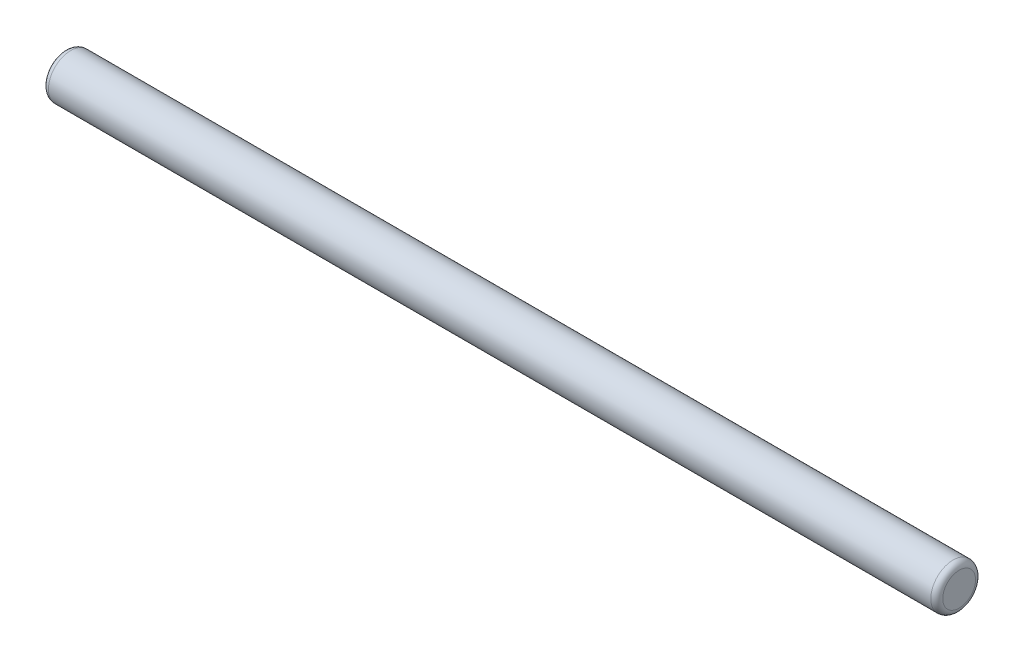
ISO-10303-21;
HEADER;
FILE_DESCRIPTION(('STEP AP214'),'2;1');
FILE_NAME('part.step','',(''),(''),'','','');
FILE_SCHEMA(('AUTOMOTIVE_DESIGN { 1 0 10303 214 1 1 1 1 }'));
ENDSEC;
DATA;
#1=APPLICATION_CONTEXT('core data for automotive mechanical design processes');
#2=APPLICATION_PROTOCOL_DEFINITION('international standard','automotive_design',2000,#1);
#3=PRODUCT_CONTEXT('',#1,'mechanical');
#4=PRODUCT('Part','Part','',(#3));
#5=PRODUCT_RELATED_PRODUCT_CATEGORY('part','',(#4));
#6=PRODUCT_DEFINITION_FORMATION('','',#4);
#7=PRODUCT_DEFINITION_CONTEXT('part definition',#1,'design');
#8=PRODUCT_DEFINITION('design','',#6,#7);
#9=PRODUCT_DEFINITION_SHAPE('','',#8);
#10=(LENGTH_UNIT() NAMED_UNIT(*) SI_UNIT(.MILLI.,.METRE.));
#11=(NAMED_UNIT(*) PLANE_ANGLE_UNIT() SI_UNIT($,.RADIAN.));
#12=(NAMED_UNIT(*) SI_UNIT($,.STERADIAN.) SOLID_ANGLE_UNIT());
#13=UNCERTAINTY_MEASURE_WITH_UNIT(LENGTH_MEASURE(1.E-05),#10,'distance_accuracy_value','');
#14=(GEOMETRIC_REPRESENTATION_CONTEXT(3) GLOBAL_UNCERTAINTY_ASSIGNED_CONTEXT((#13)) GLOBAL_UNIT_ASSIGNED_CONTEXT((#10,
#11,#12)) REPRESENTATION_CONTEXT('',''));
#15=CARTESIAN_POINT('',(0.,0.,0.));
#16=DIRECTION('',(0.,0.,1.));
#17=DIRECTION('',(1.,0.,0.));
#18=AXIS2_PLACEMENT_3D('',#15,#16,#17);
#19=CARTESIAN_POINT('',(3.,0.,0.));
#20=DIRECTION('',(-1.,0.,0.));
#21=DIRECTION('',(0.,0.,1.));
#22=AXIS2_PLACEMENT_3D('',#19,#20,#21);
#23=CYLINDRICAL_SURFACE('',#22,0.075);
#24=CARTESIAN_POINT('',(2.98,0.,0.));
#25=DIRECTION('',(1.,0.,0.));
#26=DIRECTION('',(0.,0.,-1.));
#27=AXIS2_PLACEMENT_3D('',#24,#25,#26);
#28=CIRCLE('',#27,0.075);
#29=CARTESIAN_POINT('',(2.98,0.,-0.075));
#30=VERTEX_POINT('',#29);
#31=EDGE_CURVE('E45',#30,#30,#28,.F.);
#32=ORIENTED_EDGE('',*,*,#31,.T.);
#33=EDGE_LOOP('',(#32));
#34=FACE_BOUND('',#33,.T.);
#35=CARTESIAN_POINT('',(0.0200000000000001,0.,0.));
#36=DIRECTION('',(1.,0.,0.));
#37=DIRECTION('',(0.,0.,-1.));
#38=AXIS2_PLACEMENT_3D('',#35,#36,#37);
#39=CIRCLE('',#38,0.075);
#40=CARTESIAN_POINT('',(0.0200000000000001,0.,-0.075));
#41=VERTEX_POINT('',#40);
#42=EDGE_CURVE('E50',#41,#41,#39,.T.);
#43=ORIENTED_EDGE('',*,*,#42,.T.);
#44=EDGE_LOOP('',(#43));
#45=FACE_BOUND('',#44,.T.);
#46=ADVANCED_FACE('F37',(#34,#45),#23,.T.);
#47=CARTESIAN_POINT('',(3.,0.,0.));
#48=DIRECTION('',(1.,0.,0.));
#49=DIRECTION('',(0.,0.,-1.));
#50=AXIS2_PLACEMENT_3D('',#47,#48,#49);
#51=PLANE('',#50);
#52=CARTESIAN_POINT('',(3.,0.,0.));
#53=DIRECTION('',(1.,0.,0.));
#54=DIRECTION('',(0.,0.,-1.));
#55=AXIS2_PLACEMENT_3D('',#52,#53,#54);
#56=CIRCLE('',#55,0.055);
#57=CARTESIAN_POINT('',(3.,0.,-0.055));
#58=VERTEX_POINT('',#57);
#59=EDGE_CURVE('E55',#58,#58,#56,.T.);
#60=ORIENTED_EDGE('',*,*,#59,.T.);
#61=EDGE_LOOP('',(#60));
#62=FACE_BOUND('',#61,.T.);
#63=ADVANCED_FACE('F62',(#62),#51,.T.);
#64=CARTESIAN_POINT('',(0.,0.,0.));
#65=DIRECTION('',(1.,0.,0.));
#66=DIRECTION('',(0.,0.,-1.));
#67=AXIS2_PLACEMENT_3D('',#64,#65,#66);
#68=PLANE('',#67);
#69=CARTESIAN_POINT('',(0.,0.,0.));
#70=DIRECTION('',(1.,0.,0.));
#71=DIRECTION('',(0.,0.,-1.));
#72=AXIS2_PLACEMENT_3D('',#69,#70,#71);
#73=CIRCLE('',#72,0.055);
#74=CARTESIAN_POINT('',(0.,0.,-0.055));
#75=VERTEX_POINT('',#74);
#76=EDGE_CURVE('E10',#75,#75,#73,.F.);
#77=ORIENTED_EDGE('',*,*,#76,.T.);
#78=EDGE_LOOP('',(#77));
#79=FACE_BOUND('',#78,.T.);
#80=ADVANCED_FACE('F66',(#79),#68,.F.);
#81=CARTESIAN_POINT('',(2.98,0.,0.));
#82=DIRECTION('',(1.,0.,0.));
#83=DIRECTION('',(0.,0.,-1.));
#84=AXIS2_PLACEMENT_3D('',#81,#82,#83);
#85=TOROIDAL_SURFACE('',#84,0.055,0.02);
#86=ORIENTED_EDGE('',*,*,#31,.F.);
#87=EDGE_LOOP('',(#86));
#88=FACE_BOUND('',#87,.T.);
#89=ORIENTED_EDGE('',*,*,#59,.F.);
#90=EDGE_LOOP('',(#89));
#91=FACE_BOUND('',#90,.T.);
#92=ADVANCED_FACE('F64',(#88,#91),#85,.T.);
#93=CARTESIAN_POINT('',(0.0200000000000001,0.,0.));
#94=DIRECTION('',(1.,0.,0.));
#95=DIRECTION('',(0.,0.,-1.));
#96=AXIS2_PLACEMENT_3D('',#93,#94,#95);
#97=TOROIDAL_SURFACE('',#96,0.055,0.02);
#98=ORIENTED_EDGE('',*,*,#76,.F.);
#99=EDGE_LOOP('',(#98));
#100=FACE_BOUND('',#99,.T.);
#101=ORIENTED_EDGE('',*,*,#42,.F.);
#102=EDGE_LOOP('',(#101));
#103=FACE_BOUND('',#102,.T.);
#104=ADVANCED_FACE('F39',(#100,#103),#97,.T.);
#105=CLOSED_SHELL('',(#46,#63,#80,#92,#104));
#106=MANIFOLD_SOLID_BREP('B2',#105);
#107=ADVANCED_BREP_SHAPE_REPRESENTATION('',(#18,#106),#14);
#108=SHAPE_DEFINITION_REPRESENTATION(#9,#107);
ENDSEC;
END-ISO-10303-21;
